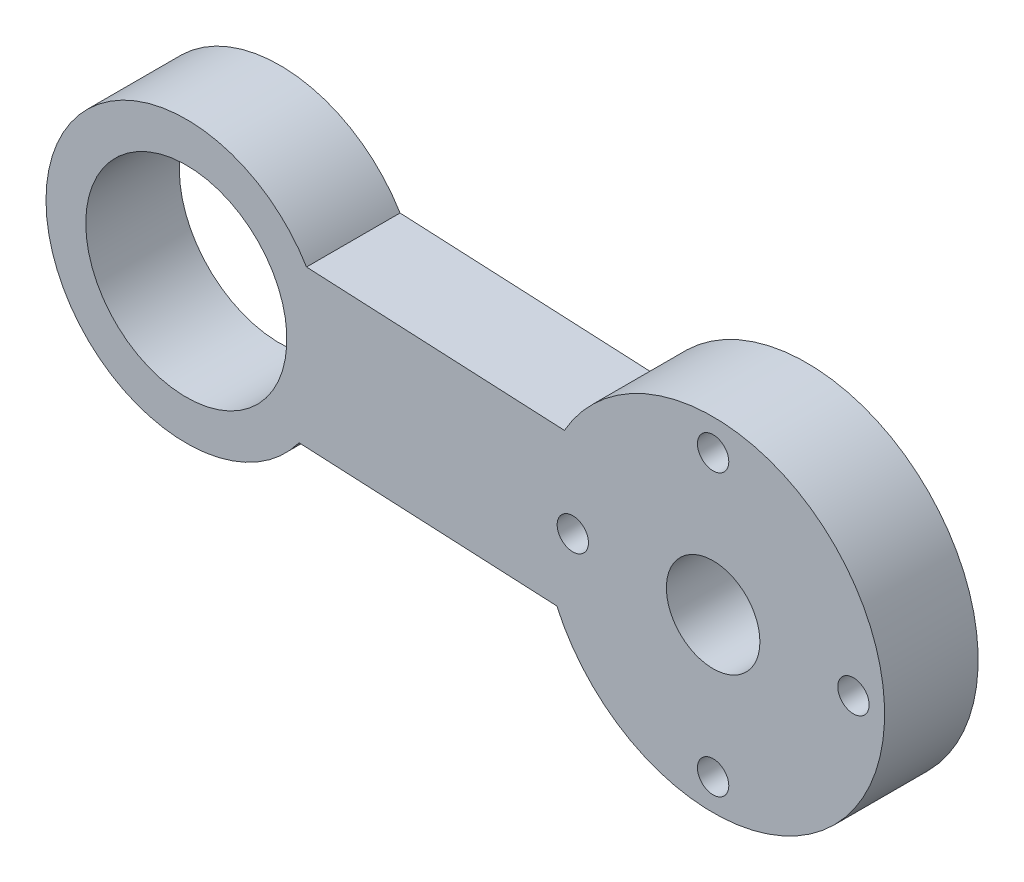
ISO-10303-21;
HEADER;
FILE_DESCRIPTION(('STEP AP214'),'2;1');
FILE_NAME('part.step','',(''),(''),'','','');
FILE_SCHEMA(('AUTOMOTIVE_DESIGN { 1 0 10303 214 1 1 1 1 }'));
ENDSEC;
DATA;
#1=APPLICATION_CONTEXT('core data for automotive mechanical design processes');
#2=APPLICATION_PROTOCOL_DEFINITION('international standard','automotive_design',2000,#1);
#3=PRODUCT_CONTEXT('',#1,'mechanical');
#4=PRODUCT('Part','Part','',(#3));
#5=PRODUCT_RELATED_PRODUCT_CATEGORY('part','',(#4));
#6=PRODUCT_DEFINITION_FORMATION('','',#4);
#7=PRODUCT_DEFINITION_CONTEXT('part definition',#1,'design');
#8=PRODUCT_DEFINITION('design','',#6,#7);
#9=PRODUCT_DEFINITION_SHAPE('','',#8);
#10=(LENGTH_UNIT() NAMED_UNIT(*) SI_UNIT(.MILLI.,.METRE.));
#11=(NAMED_UNIT(*) PLANE_ANGLE_UNIT() SI_UNIT($,.RADIAN.));
#12=(NAMED_UNIT(*) SI_UNIT($,.STERADIAN.) SOLID_ANGLE_UNIT());
#13=UNCERTAINTY_MEASURE_WITH_UNIT(LENGTH_MEASURE(1.E-05),#10,'distance_accuracy_value','');
#14=(GEOMETRIC_REPRESENTATION_CONTEXT(3) GLOBAL_UNCERTAINTY_ASSIGNED_CONTEXT((#13)) GLOBAL_UNIT_ASSIGNED_CONTEXT((#10,
#11,#12)) REPRESENTATION_CONTEXT('',''));
#15=CARTESIAN_POINT('',(0.,0.,0.));
#16=DIRECTION('',(0.,0.,1.));
#17=DIRECTION('',(1.,0.,0.));
#18=AXIS2_PLACEMENT_3D('',#15,#16,#17);
#19=CARTESIAN_POINT('',(0.,0.,6.));
#20=DIRECTION('',(0.,0.,-1.));
#21=DIRECTION('',(-1.,0.,0.));
#22=AXIS2_PLACEMENT_3D('',#19,#20,#21);
#23=CYLINDRICAL_SURFACE('',#22,11.);
#24=CARTESIAN_POINT('',(0.,0.,0.));
#25=DIRECTION('',(0.,0.,1.));
#26=DIRECTION('',(1.,0.,0.));
#27=AXIS2_PLACEMENT_3D('',#24,#25,#26);
#28=CIRCLE('',#27,11.);
#29=CARTESIAN_POINT('',(-10.02588736957,-4.52565823419065,0.));
#30=VERTEX_POINT('',#29);
#31=CARTESIAN_POINT('',(-9.54104722926762,5.47434176580936,0.));
#32=VERTEX_POINT('',#31);
#33=EDGE_CURVE('E80',#30,#32,#28,.T.);
#34=ORIENTED_EDGE('',*,*,#33,.T.);
#35=DIRECTION('',(0.,0.,-1.));
#36=VECTOR('',#35,1.);
#37=CARTESIAN_POINT('',(-9.54104722926762,5.47434176580936,6.));
#38=LINE('',#37,#36);
#39=CARTESIAN_POINT('',(-9.54104722926762,5.47434176580936,6.));
#40=VERTEX_POINT('',#39);
#41=EDGE_CURVE('E11',#40,#32,#38,.T.);
#42=ORIENTED_EDGE('',*,*,#41,.F.);
#43=CARTESIAN_POINT('',(0.,0.,6.));
#44=DIRECTION('',(0.,0.,1.));
#45=DIRECTION('',(1.,0.,0.));
#46=AXIS2_PLACEMENT_3D('',#43,#44,#45);
#47=CIRCLE('',#46,11.);
#48=CARTESIAN_POINT('',(-10.02588736957,-4.52565823419065,6.));
#49=VERTEX_POINT('',#48);
#50=EDGE_CURVE('E82',#49,#40,#47,.T.);
#51=ORIENTED_EDGE('',*,*,#50,.F.);
#52=DIRECTION('',(0.,0.,-1.));
#53=VECTOR('',#52,1.);
#54=CARTESIAN_POINT('',(-10.02588736957,-4.52565823419065,6.));
#55=LINE('',#54,#53);
#56=EDGE_CURVE('E40',#49,#30,#55,.T.);
#57=ORIENTED_EDGE('',*,*,#56,.T.);
#58=EDGE_LOOP('',(#34,#42,#51,#57));
#59=FACE_BOUND('',#58,.T.);
#60=ADVANCED_FACE('F33',(#59),#23,.T.);
#61=CARTESIAN_POINT('',(-9.54104722926762,5.47434176580936,6.));
#62=DIRECTION('',(-0.0484345394381607,-0.998826358978082,0.));
#63=DIRECTION('',(0.998826358978083,-0.0484345394381607,0.));
#64=AXIS2_PLACEMENT_3D('',#61,#62,#63);
#65=PLANE('',#64);
#66=DIRECTION('',(-0.998826358978083,0.0484345394381607,0.));
#67=VECTOR('',#66,1.);
#68=CARTESIAN_POINT('',(-9.54104722926762,5.47434176580936,0.));
#69=LINE('',#68,#67);
#70=CARTESIAN_POINT('',(-26.0813725342701,6.276406139766,0.));
#71=VERTEX_POINT('',#70);
#72=EDGE_CURVE('E83',#32,#71,#69,.T.);
#73=ORIENTED_EDGE('',*,*,#72,.T.);
#74=DIRECTION('',(0.,0.,-1.));
#75=VECTOR('',#74,1.);
#76=CARTESIAN_POINT('',(-26.0813725342701,6.276406139766,6.));
#77=LINE('',#76,#75);
#78=CARTESIAN_POINT('',(-26.0813725342701,6.276406139766,6.));
#79=VERTEX_POINT('',#78);
#80=EDGE_CURVE('E55',#71,#79,#77,.F.);
#81=ORIENTED_EDGE('',*,*,#80,.T.);
#82=DIRECTION('',(-0.998826358978083,0.0484345394381607,0.));
#83=VECTOR('',#82,1.);
#84=CARTESIAN_POINT('',(-9.54104722926762,5.47434176580936,6.));
#85=LINE('',#84,#83);
#86=EDGE_CURVE('E134',#40,#79,#85,.T.);
#87=ORIENTED_EDGE('',*,*,#86,.F.);
#88=ORIENTED_EDGE('',*,*,#41,.T.);
#89=EDGE_LOOP('',(#73,#81,#87,#88));
#90=FACE_BOUND('',#89,.T.);
#91=ADVANCED_FACE('F144',(#90),#65,.F.);
#92=CARTESIAN_POINT('',(-10.02588736957,-4.52565823419065,6.));
#93=DIRECTION('',(0.0484345394381607,0.998826358978082,0.));
#94=DIRECTION('',(-0.998826358978083,0.0484345394381608,0.));
#95=AXIS2_PLACEMENT_3D('',#92,#93,#94);
#96=PLANE('',#95);
#97=DIRECTION('',(0.998826358978083,-0.0484345394381608,0.));
#98=VECTOR('',#97,1.);
#99=CARTESIAN_POINT('',(-10.02588736957,-4.52565823419065,6.));
#100=LINE('',#99,#98);
#101=CARTESIAN_POINT('',(-26.5584342212489,-3.72397104872215,6.));
#102=VERTEX_POINT('',#101);
#103=EDGE_CURVE('E47',#102,#49,#100,.T.);
#104=ORIENTED_EDGE('',*,*,#103,.F.);
#105=DIRECTION('',(0.,0.,-1.));
#106=VECTOR('',#105,1.);
#107=CARTESIAN_POINT('',(-26.5584342212489,-3.72397104872215,6.));
#108=LINE('',#107,#106);
#109=CARTESIAN_POINT('',(-26.5584342212489,-3.72397104872215,0.));
#110=VERTEX_POINT('',#109);
#111=EDGE_CURVE('E85',#102,#110,#108,.T.);
#112=ORIENTED_EDGE('',*,*,#111,.T.);
#113=DIRECTION('',(0.998826358978083,-0.0484345394381608,0.));
#114=VECTOR('',#113,1.);
#115=CARTESIAN_POINT('',(-10.02588736957,-4.52565823419065,0.));
#116=LINE('',#115,#114);
#117=EDGE_CURVE('E74',#110,#30,#116,.T.);
#118=ORIENTED_EDGE('',*,*,#117,.T.);
#119=ORIENTED_EDGE('',*,*,#56,.F.);
#120=EDGE_LOOP('',(#104,#112,#118,#119));
#121=FACE_BOUND('',#120,.T.);
#122=ADVANCED_FACE('F86',(#121),#96,.F.);
#123=CARTESIAN_POINT('',(0.,0.,6.));
#124=DIRECTION('',(0.,0.,1.));
#125=DIRECTION('',(1.,0.,0.));
#126=AXIS2_PLACEMENT_3D('',#123,#124,#125);
#127=PLANE('',#126);
#128=CARTESIAN_POINT('',(-33.7907935724079,1.63261165069584,6.));
#129=DIRECTION('',(0.,0.,-1.));
#130=DIRECTION('',(-1.,0.,0.));
#131=AXIS2_PLACEMENT_3D('',#128,#129,#130);
#132=CIRCLE('',#131,6.45);
#133=CARTESIAN_POINT('',(-40.2407935724079,1.63261165069584,6.));
#134=VERTEX_POINT('',#133);
#135=EDGE_CURVE('E93',#134,#134,#132,.T.);
#136=ORIENTED_EDGE('',*,*,#135,.T.);
#137=EDGE_LOOP('',(#136));
#138=FACE_BOUND('',#137,.T.);
#139=ORIENTED_EDGE('',*,*,#86,.T.);
#140=CARTESIAN_POINT('',(-33.7907935724079,1.63261165069584,6.));
#141=DIRECTION('',(0.,0.,-1.));
#142=DIRECTION('',(-1.,0.,0.));
#143=AXIS2_PLACEMENT_3D('',#140,#141,#142);
#144=CIRCLE('',#143,9.);
#145=EDGE_CURVE('E90',#102,#79,#144,.T.);
#146=ORIENTED_EDGE('',*,*,#145,.F.);
#147=ORIENTED_EDGE('',*,*,#103,.T.);
#148=ORIENTED_EDGE('',*,*,#50,.T.);
#149=EDGE_LOOP('',(#139,#146,#147,#148));
#150=FACE_BOUND('',#149,.T.);
#151=CARTESIAN_POINT('',(0.,0.,6.));
#152=DIRECTION('',(0.,0.,1.));
#153=DIRECTION('',(1.,0.,0.));
#154=AXIS2_PLACEMENT_3D('',#151,#152,#153);
#155=CIRCLE('',#154,3.);
#156=CARTESIAN_POINT('',(3.,0.,6.));
#157=VERTEX_POINT('',#156);
#158=EDGE_CURVE('E102',#157,#157,#155,.T.);
#159=ORIENTED_EDGE('',*,*,#158,.F.);
#160=EDGE_LOOP('',(#159));
#161=FACE_BOUND('',#160,.T.);
#162=CARTESIAN_POINT('',(-9.,0.,6.));
#163=DIRECTION('',(0.,0.,1.));
#164=DIRECTION('',(1.,0.,0.));
#165=AXIS2_PLACEMENT_3D('',#162,#163,#164);
#166=CIRCLE('',#165,1.005);
#167=CARTESIAN_POINT('',(-7.995,0.,6.));
#168=VERTEX_POINT('',#167);
#169=EDGE_CURVE('E106',#168,#168,#166,.T.);
#170=ORIENTED_EDGE('',*,*,#169,.F.);
#171=EDGE_LOOP('',(#170));
#172=FACE_BOUND('',#171,.T.);
#173=CARTESIAN_POINT('',(0.,-9.,6.));
#174=DIRECTION('',(0.,0.,1.));
#175=DIRECTION('',(1.,0.,0.));
#176=AXIS2_PLACEMENT_3D('',#173,#174,#175);
#177=CIRCLE('',#176,1.005);
#178=CARTESIAN_POINT('',(1.005,-9.,6.));
#179=VERTEX_POINT('',#178);
#180=EDGE_CURVE('E112',#179,#179,#177,.T.);
#181=ORIENTED_EDGE('',*,*,#180,.F.);
#182=EDGE_LOOP('',(#181));
#183=FACE_BOUND('',#182,.T.);
#184=CARTESIAN_POINT('',(9.,0.,6.));
#185=DIRECTION('',(0.,0.,1.));
#186=DIRECTION('',(1.,0.,0.));
#187=AXIS2_PLACEMENT_3D('',#184,#185,#186);
#188=CIRCLE('',#187,1.005);
#189=CARTESIAN_POINT('',(10.005,0.,6.));
#190=VERTEX_POINT('',#189);
#191=EDGE_CURVE('E118',#190,#190,#188,.T.);
#192=ORIENTED_EDGE('',*,*,#191,.F.);
#193=EDGE_LOOP('',(#192));
#194=FACE_BOUND('',#193,.T.);
#195=CARTESIAN_POINT('',(0.,9.,6.));
#196=DIRECTION('',(0.,0.,1.));
#197=DIRECTION('',(1.,0.,0.));
#198=AXIS2_PLACEMENT_3D('',#195,#196,#197);
#199=CIRCLE('',#198,1.005);
#200=CARTESIAN_POINT('',(1.005,9.,6.));
#201=VERTEX_POINT('',#200);
#202=EDGE_CURVE('E124',#201,#201,#199,.T.);
#203=ORIENTED_EDGE('',*,*,#202,.F.);
#204=EDGE_LOOP('',(#203));
#205=FACE_BOUND('',#204,.T.);
#206=ADVANCED_FACE('F142',(#138,#150,#161,#172,#183,#194,#205),#127,.T.);
#207=CARTESIAN_POINT('',(0.,0.,0.));
#208=DIRECTION('',(0.,0.,1.));
#209=DIRECTION('',(1.,0.,0.));
#210=AXIS2_PLACEMENT_3D('',#207,#208,#209);
#211=PLANE('',#210);
#212=CARTESIAN_POINT('',(-33.7907935724079,1.63261165069584,0.));
#213=DIRECTION('',(0.,0.,-1.));
#214=DIRECTION('',(-1.,0.,0.));
#215=AXIS2_PLACEMENT_3D('',#212,#213,#214);
#216=CIRCLE('',#215,6.45);
#217=CARTESIAN_POINT('',(-40.2407935724079,1.63261165069584,0.));
#218=VERTEX_POINT('',#217);
#219=EDGE_CURVE('E97',#218,#218,#216,.T.);
#220=ORIENTED_EDGE('',*,*,#219,.F.);
#221=EDGE_LOOP('',(#220));
#222=FACE_BOUND('',#221,.T.);
#223=CARTESIAN_POINT('',(-33.7907935724079,1.63261165069584,0.));
#224=DIRECTION('',(0.,0.,-1.));
#225=DIRECTION('',(-1.,0.,0.));
#226=AXIS2_PLACEMENT_3D('',#223,#224,#225);
#227=CIRCLE('',#226,9.);
#228=EDGE_CURVE('E78',#110,#71,#227,.T.);
#229=ORIENTED_EDGE('',*,*,#228,.T.);
#230=ORIENTED_EDGE('',*,*,#72,.F.);
#231=ORIENTED_EDGE('',*,*,#33,.F.);
#232=ORIENTED_EDGE('',*,*,#117,.F.);
#233=EDGE_LOOP('',(#229,#230,#231,#232));
#234=FACE_BOUND('',#233,.T.);
#235=CARTESIAN_POINT('',(0.,0.,0.));
#236=DIRECTION('',(0.,0.,1.));
#237=DIRECTION('',(1.,0.,0.));
#238=AXIS2_PLACEMENT_3D('',#235,#236,#237);
#239=CIRCLE('',#238,3.);
#240=CARTESIAN_POINT('',(3.,0.,0.));
#241=VERTEX_POINT('',#240);
#242=EDGE_CURVE('E103',#241,#241,#239,.T.);
#243=ORIENTED_EDGE('',*,*,#242,.T.);
#244=EDGE_LOOP('',(#243));
#245=FACE_BOUND('',#244,.T.);
#246=CARTESIAN_POINT('',(-9.,0.,0.));
#247=DIRECTION('',(0.,0.,1.));
#248=DIRECTION('',(1.,0.,0.));
#249=AXIS2_PLACEMENT_3D('',#246,#247,#248);
#250=CIRCLE('',#249,1.005);
#251=CARTESIAN_POINT('',(-7.995,0.,0.));
#252=VERTEX_POINT('',#251);
#253=EDGE_CURVE('E109',#252,#252,#250,.T.);
#254=ORIENTED_EDGE('',*,*,#253,.T.);
#255=EDGE_LOOP('',(#254));
#256=FACE_BOUND('',#255,.T.);
#257=CARTESIAN_POINT('',(0.,-9.,0.));
#258=DIRECTION('',(0.,0.,1.));
#259=DIRECTION('',(1.,0.,0.));
#260=AXIS2_PLACEMENT_3D('',#257,#258,#259);
#261=CIRCLE('',#260,1.005);
#262=CARTESIAN_POINT('',(1.005,-9.,0.));
#263=VERTEX_POINT('',#262);
#264=EDGE_CURVE('E115',#263,#263,#261,.T.);
#265=ORIENTED_EDGE('',*,*,#264,.T.);
#266=EDGE_LOOP('',(#265));
#267=FACE_BOUND('',#266,.T.);
#268=CARTESIAN_POINT('',(9.,0.,0.));
#269=DIRECTION('',(0.,0.,1.));
#270=DIRECTION('',(1.,0.,0.));
#271=AXIS2_PLACEMENT_3D('',#268,#269,#270);
#272=CIRCLE('',#271,1.005);
#273=CARTESIAN_POINT('',(10.005,0.,0.));
#274=VERTEX_POINT('',#273);
#275=EDGE_CURVE('E121',#274,#274,#272,.T.);
#276=ORIENTED_EDGE('',*,*,#275,.T.);
#277=EDGE_LOOP('',(#276));
#278=FACE_BOUND('',#277,.T.);
#279=CARTESIAN_POINT('',(0.,9.,0.));
#280=DIRECTION('',(0.,0.,1.));
#281=DIRECTION('',(1.,0.,0.));
#282=AXIS2_PLACEMENT_3D('',#279,#280,#281);
#283=CIRCLE('',#282,1.005);
#284=CARTESIAN_POINT('',(1.005,9.,0.));
#285=VERTEX_POINT('',#284);
#286=EDGE_CURVE('E127',#285,#285,#283,.T.);
#287=ORIENTED_EDGE('',*,*,#286,.T.);
#288=EDGE_LOOP('',(#287));
#289=FACE_BOUND('',#288,.T.);
#290=ADVANCED_FACE('F75',(#222,#234,#245,#256,#267,#278,#289),#211,.F.);
#291=CARTESIAN_POINT('',(0.,9.,0.));
#292=DIRECTION('',(0.,0.,1.));
#293=DIRECTION('',(1.,0.,0.));
#294=AXIS2_PLACEMENT_3D('',#291,#292,#293);
#295=CYLINDRICAL_SURFACE('',#294,1.005);
#296=ORIENTED_EDGE('',*,*,#286,.F.);
#297=EDGE_LOOP('',(#296));
#298=FACE_BOUND('',#297,.T.);
#299=ORIENTED_EDGE('',*,*,#202,.T.);
#300=EDGE_LOOP('',(#299));
#301=FACE_BOUND('',#300,.T.);
#302=ADVANCED_FACE('F154',(#298,#301),#295,.F.);
#303=CARTESIAN_POINT('',(9.,0.,0.));
#304=DIRECTION('',(0.,0.,1.));
#305=DIRECTION('',(1.,0.,0.));
#306=AXIS2_PLACEMENT_3D('',#303,#304,#305);
#307=CYLINDRICAL_SURFACE('',#306,1.005);
#308=ORIENTED_EDGE('',*,*,#275,.F.);
#309=EDGE_LOOP('',(#308));
#310=FACE_BOUND('',#309,.T.);
#311=ORIENTED_EDGE('',*,*,#191,.T.);
#312=EDGE_LOOP('',(#311));
#313=FACE_BOUND('',#312,.T.);
#314=ADVANCED_FACE('F161',(#310,#313),#307,.F.);
#315=CARTESIAN_POINT('',(0.,-9.,0.));
#316=DIRECTION('',(0.,0.,1.));
#317=DIRECTION('',(1.,0.,0.));
#318=AXIS2_PLACEMENT_3D('',#315,#316,#317);
#319=CYLINDRICAL_SURFACE('',#318,1.005);
#320=ORIENTED_EDGE('',*,*,#264,.F.);
#321=EDGE_LOOP('',(#320));
#322=FACE_BOUND('',#321,.T.);
#323=ORIENTED_EDGE('',*,*,#180,.T.);
#324=EDGE_LOOP('',(#323));
#325=FACE_BOUND('',#324,.T.);
#326=ADVANCED_FACE('F165',(#322,#325),#319,.F.);
#327=CARTESIAN_POINT('',(-9.,0.,0.));
#328=DIRECTION('',(0.,0.,1.));
#329=DIRECTION('',(1.,0.,0.));
#330=AXIS2_PLACEMENT_3D('',#327,#328,#329);
#331=CYLINDRICAL_SURFACE('',#330,1.005);
#332=ORIENTED_EDGE('',*,*,#253,.F.);
#333=EDGE_LOOP('',(#332));
#334=FACE_BOUND('',#333,.T.);
#335=ORIENTED_EDGE('',*,*,#169,.T.);
#336=EDGE_LOOP('',(#335));
#337=FACE_BOUND('',#336,.T.);
#338=ADVANCED_FACE('F169',(#334,#337),#331,.F.);
#339=CARTESIAN_POINT('',(0.,0.,0.));
#340=DIRECTION('',(0.,0.,1.));
#341=DIRECTION('',(1.,0.,0.));
#342=AXIS2_PLACEMENT_3D('',#339,#340,#341);
#343=CYLINDRICAL_SURFACE('',#342,3.);
#344=ORIENTED_EDGE('',*,*,#242,.F.);
#345=EDGE_LOOP('',(#344));
#346=FACE_BOUND('',#345,.T.);
#347=ORIENTED_EDGE('',*,*,#158,.T.);
#348=EDGE_LOOP('',(#347));
#349=FACE_BOUND('',#348,.T.);
#350=ADVANCED_FACE('F173',(#346,#349),#343,.F.);
#351=CARTESIAN_POINT('',(-33.7907935724079,1.63261165069584,6.));
#352=DIRECTION('',(0.,0.,-1.));
#353=DIRECTION('',(-1.,0.,0.));
#354=AXIS2_PLACEMENT_3D('',#351,#352,#353);
#355=CYLINDRICAL_SURFACE('',#354,9.);
#356=ORIENTED_EDGE('',*,*,#80,.F.);
#357=ORIENTED_EDGE('',*,*,#228,.F.);
#358=ORIENTED_EDGE('',*,*,#111,.F.);
#359=ORIENTED_EDGE('',*,*,#145,.T.);
#360=EDGE_LOOP('',(#356,#357,#358,#359));
#361=FACE_BOUND('',#360,.T.);
#362=ADVANCED_FACE('F92',(#361),#355,.T.);
#363=CARTESIAN_POINT('',(-33.7907935724079,1.63261165069584,6.));
#364=DIRECTION('',(0.,0.,-1.));
#365=DIRECTION('',(-1.,0.,0.));
#366=AXIS2_PLACEMENT_3D('',#363,#364,#365);
#367=CYLINDRICAL_SURFACE('',#366,6.45);
#368=ORIENTED_EDGE('',*,*,#135,.F.);
#369=EDGE_LOOP('',(#368));
#370=FACE_BOUND('',#369,.T.);
#371=ORIENTED_EDGE('',*,*,#219,.T.);
#372=EDGE_LOOP('',(#371));
#373=FACE_BOUND('',#372,.T.);
#374=ADVANCED_FACE('F180',(#370,#373),#367,.F.);
#375=CLOSED_SHELL('',(#60,#91,#122,#206,#290,#302,#314,#326,#338,#350,#362,#374));
#376=MANIFOLD_SOLID_BREP('B2',#375);
#377=ADVANCED_BREP_SHAPE_REPRESENTATION('',(#18,#376),#14);
#378=SHAPE_DEFINITION_REPRESENTATION(#9,#377);
ENDSEC;
END-ISO-10303-21;
